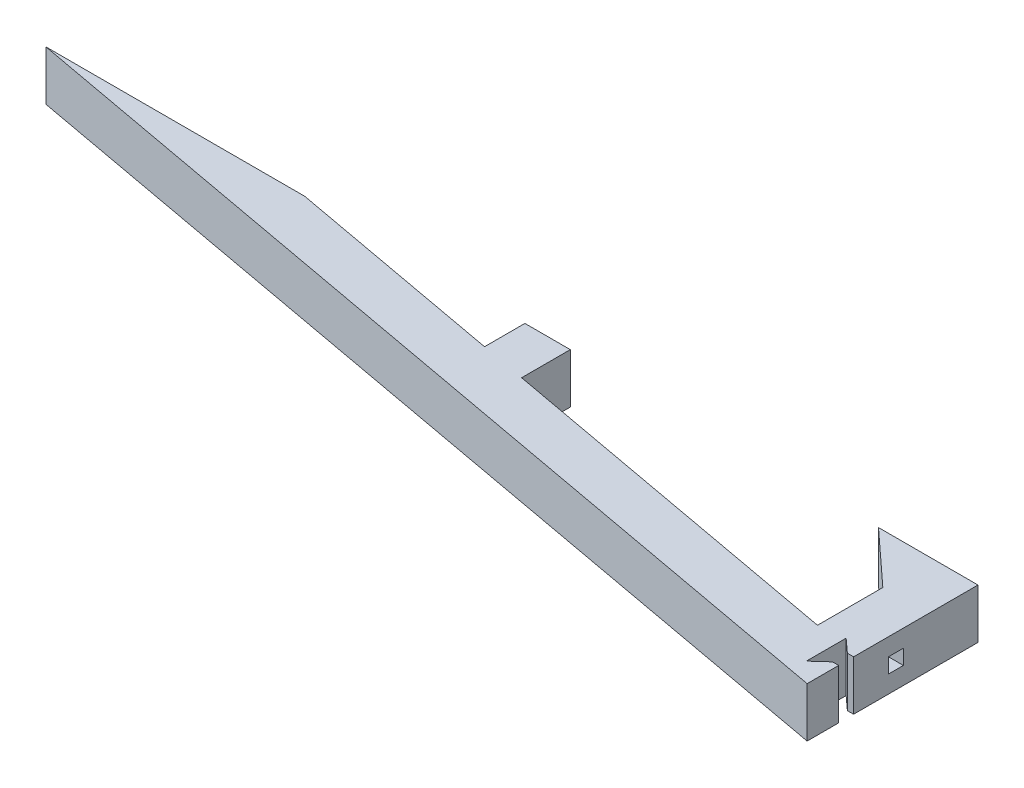
ISO-10303-21;
HEADER;
FILE_DESCRIPTION(('STEP AP214'),'2;1');
FILE_NAME('part.step','',(''),(''),'','','');
FILE_SCHEMA(('AUTOMOTIVE_DESIGN { 1 0 10303 214 1 1 1 1 }'));
ENDSEC;
DATA;
#1=APPLICATION_CONTEXT('core data for automotive mechanical design processes');
#2=APPLICATION_PROTOCOL_DEFINITION('international standard','automotive_design',2000,#1);
#3=PRODUCT_CONTEXT('',#1,'mechanical');
#4=PRODUCT('Part','Part','',(#3));
#5=PRODUCT_RELATED_PRODUCT_CATEGORY('part','',(#4));
#6=PRODUCT_DEFINITION_FORMATION('','',#4);
#7=PRODUCT_DEFINITION_CONTEXT('part definition',#1,'design');
#8=PRODUCT_DEFINITION('design','',#6,#7);
#9=PRODUCT_DEFINITION_SHAPE('','',#8);
#10=(LENGTH_UNIT() NAMED_UNIT(*) SI_UNIT(.MILLI.,.METRE.));
#11=(NAMED_UNIT(*) PLANE_ANGLE_UNIT() SI_UNIT($,.RADIAN.));
#12=(NAMED_UNIT(*) SI_UNIT($,.STERADIAN.) SOLID_ANGLE_UNIT());
#13=UNCERTAINTY_MEASURE_WITH_UNIT(LENGTH_MEASURE(1.E-05),#10,'distance_accuracy_value','');
#14=(GEOMETRIC_REPRESENTATION_CONTEXT(3) GLOBAL_UNCERTAINTY_ASSIGNED_CONTEXT((#13)) GLOBAL_UNIT_ASSIGNED_CONTEXT((#10,
#11,#12)) REPRESENTATION_CONTEXT('',''));
#15=CARTESIAN_POINT('',(0.,0.,0.));
#16=DIRECTION('',(0.,0.,1.));
#17=DIRECTION('',(1.,0.,0.));
#18=AXIS2_PLACEMENT_3D('',#15,#16,#17);
#19=CARTESIAN_POINT('',(0.,8.,0.));
#20=DIRECTION('',(-1.,0.,0.));
#21=DIRECTION('',(0.,0.,1.));
#22=AXIS2_PLACEMENT_3D('',#19,#20,#21);
#23=PLANE('',#22);
#24=DIRECTION('',(0.,0.,-1.));
#25=VECTOR('',#24,1.);
#26=CARTESIAN_POINT('',(0.,0.,0.));
#27=LINE('',#26,#25);
#28=CARTESIAN_POINT('',(0.,0.,27.47211487));
#29=VERTEX_POINT('',#28);
#30=CARTESIAN_POINT('',(0.,0.,22.4));
#31=VERTEX_POINT('',#30);
#32=EDGE_CURVE('E274',#29,#31,#27,.T.);
#33=ORIENTED_EDGE('',*,*,#32,.T.);
#34=DIRECTION('',(0.,1.,0.));
#35=VECTOR('',#34,1.);
#36=CARTESIAN_POINT('',(0.,0.,22.4));
#37=LINE('',#36,#35);
#38=CARTESIAN_POINT('',(0.,8.,22.4));
#39=VERTEX_POINT('',#38);
#40=EDGE_CURVE('E257',#31,#39,#37,.T.);
#41=ORIENTED_EDGE('',*,*,#40,.T.);
#42=DIRECTION('',(0.,0.,-1.));
#43=VECTOR('',#42,1.);
#44=CARTESIAN_POINT('',(0.,8.,0.));
#45=LINE('',#44,#43);
#46=CARTESIAN_POINT('',(0.,8.,27.47211487));
#47=VERTEX_POINT('',#46);
#48=EDGE_CURVE('E291',#47,#39,#45,.T.);
#49=ORIENTED_EDGE('',*,*,#48,.F.);
#50=DIRECTION('',(0.,-1.,0.));
#51=VECTOR('',#50,1.);
#52=CARTESIAN_POINT('',(0.,8.,27.47211487));
#53=LINE('',#52,#51);
#54=EDGE_CURVE('E318',#47,#29,#53,.T.);
#55=ORIENTED_EDGE('',*,*,#54,.T.);
#56=EDGE_LOOP('',(#33,#41,#49,#55));
#57=FACE_BOUND('',#56,.T.);
#58=ADVANCED_FACE('F33',(#57),#23,.F.);
#59=CARTESIAN_POINT('',(-7.3,8.,0.));
#60=DIRECTION('',(0.,0.,1.));
#61=DIRECTION('',(1.,0.,0.));
#62=AXIS2_PLACEMENT_3D('',#59,#60,#61);
#63=PLANE('',#62);
#64=CARTESIAN_POINT('',(-3.65,4.,0.));
#65=DIRECTION('',(0.,0.,-1.));
#66=DIRECTION('',(-1.,0.,0.));
#67=AXIS2_PLACEMENT_3D('',#64,#65,#66);
#68=CIRCLE('',#67,2.2);
#69=CARTESIAN_POINT('',(-5.85,4.,0.));
#70=VERTEX_POINT('',#69);
#71=EDGE_CURVE('E590',#70,#70,#68,.T.);
#72=ORIENTED_EDGE('',*,*,#71,.F.);
#73=EDGE_LOOP('',(#72));
#74=FACE_BOUND('',#73,.T.);
#75=DIRECTION('',(-1.,0.,0.));
#76=VECTOR('',#75,1.);
#77=CARTESIAN_POINT('',(-7.3,0.,0.));
#78=LINE('',#77,#76);
#79=CARTESIAN_POINT('',(0.,0.,0.));
#80=VERTEX_POINT('',#79);
#81=CARTESIAN_POINT('',(-16.,0.,0.));
#82=VERTEX_POINT('',#81);
#83=EDGE_CURVE('E260',#80,#82,#78,.T.);
#84=ORIENTED_EDGE('',*,*,#83,.T.);
#85=DIRECTION('',(0.,1.,0.));
#86=VECTOR('',#85,1.);
#87=CARTESIAN_POINT('',(-16.,0.,0.));
#88=LINE('',#87,#86);
#89=CARTESIAN_POINT('',(-16.,8.,0.));
#90=VERTEX_POINT('',#89);
#91=EDGE_CURVE('E222',#82,#90,#88,.T.);
#92=ORIENTED_EDGE('',*,*,#91,.T.);
#93=DIRECTION('',(-1.,0.,0.));
#94=VECTOR('',#93,1.);
#95=CARTESIAN_POINT('',(-7.3,8.,0.));
#96=LINE('',#95,#94);
#97=CARTESIAN_POINT('',(0.,8.,0.));
#98=VERTEX_POINT('',#97);
#99=EDGE_CURVE('E270',#98,#90,#96,.T.);
#100=ORIENTED_EDGE('',*,*,#99,.F.);
#101=DIRECTION('',(0.,-1.,0.));
#102=VECTOR('',#101,1.);
#103=CARTESIAN_POINT('',(0.,8.,0.));
#104=LINE('',#103,#102);
#105=EDGE_CURVE('E294',#98,#80,#104,.T.);
#106=ORIENTED_EDGE('',*,*,#105,.T.);
#107=EDGE_LOOP('',(#84,#92,#100,#106));
#108=FACE_BOUND('',#107,.T.);
#109=ADVANCED_FACE('F35',(#74,#108),#63,.F.);
#110=CARTESIAN_POINT('',(-7.3,8.,18.5087593431004));
#111=DIRECTION('',(1.,0.,0.));
#112=DIRECTION('',(0.,0.,-1.));
#113=AXIS2_PLACEMENT_3D('',#110,#111,#112);
#114=PLANE('',#113);
#115=DIRECTION('',(0.,0.,1.));
#116=VECTOR('',#115,1.);
#117=CARTESIAN_POINT('',(-7.3,8.,18.5087593431004));
#118=LINE('',#117,#116);
#119=CARTESIAN_POINT('',(-7.3,8.,8.));
#120=VERTEX_POINT('',#119);
#121=CARTESIAN_POINT('',(-7.3,8.,18.5087593431004));
#122=VERTEX_POINT('',#121);
#123=EDGE_CURVE('E273',#120,#122,#118,.T.);
#124=ORIENTED_EDGE('',*,*,#123,.F.);
#125=DIRECTION('',(0.,-1.,0.));
#126=VECTOR('',#125,1.);
#127=CARTESIAN_POINT('',(-7.3,8.,8.));
#128=LINE('',#127,#126);
#129=CARTESIAN_POINT('',(-7.3,0.,8.));
#130=VERTEX_POINT('',#129);
#131=EDGE_CURVE('E226',#120,#130,#128,.T.);
#132=ORIENTED_EDGE('',*,*,#131,.T.);
#133=DIRECTION('',(0.,0.,1.));
#134=VECTOR('',#133,1.);
#135=CARTESIAN_POINT('',(-7.3,0.,18.5087593431004));
#136=LINE('',#135,#134);
#137=CARTESIAN_POINT('',(-7.3,0.,18.5087593431004));
#138=VERTEX_POINT('',#137);
#139=EDGE_CURVE('E297',#130,#138,#136,.T.);
#140=ORIENTED_EDGE('',*,*,#139,.T.);
#141=DIRECTION('',(0.,-1.,0.));
#142=VECTOR('',#141,1.);
#143=CARTESIAN_POINT('',(-7.3,8.,18.5087593431004));
#144=LINE('',#143,#142);
#145=EDGE_CURVE('E11',#122,#138,#144,.T.);
#146=ORIENTED_EDGE('',*,*,#145,.F.);
#147=EDGE_LOOP('',(#124,#132,#140,#146));
#148=FACE_BOUND('',#147,.T.);
#149=ADVANCED_FACE('F368',(#148),#114,.F.);
#150=CARTESIAN_POINT('',(-65.55,8.,7.82944326528233));
#151=DIRECTION('',(-0.180330309758334,0.,0.983606109874508));
#152=DIRECTION('',(0.983606109874508,0.,0.180330309758334));
#153=AXIS2_PLACEMENT_3D('',#150,#151,#152);
#154=PLANE('',#153);
#155=DIRECTION('',(-0.983606109874508,0.,-0.180330309758334));
#156=VECTOR('',#155,1.);
#157=CARTESIAN_POINT('',(-65.55,0.,7.82944326528233));
#158=LINE('',#157,#156);
#159=CARTESIAN_POINT('',(-65.55,0.,7.82944326528233));
#160=VERTEX_POINT('',#159);
#161=EDGE_CURVE('E299',#138,#160,#158,.T.);
#162=ORIENTED_EDGE('',*,*,#161,.T.);
#163=DIRECTION('',(0.,-1.,0.));
#164=VECTOR('',#163,1.);
#165=CARTESIAN_POINT('',(-65.55,8.,7.82944326528233));
#166=LINE('',#165,#164);
#167=CARTESIAN_POINT('',(-65.55,8.,7.82944326528233));
#168=VERTEX_POINT('',#167);
#169=EDGE_CURVE('E41',#168,#160,#166,.T.);
#170=ORIENTED_EDGE('',*,*,#169,.F.);
#171=DIRECTION('',(-0.983606109874508,0.,-0.180330309758334));
#172=VECTOR('',#171,1.);
#173=CARTESIAN_POINT('',(-65.55,8.,7.82944326528233));
#174=LINE('',#173,#172);
#175=EDGE_CURVE('E276',#122,#168,#174,.T.);
#176=ORIENTED_EDGE('',*,*,#175,.F.);
#177=ORIENTED_EDGE('',*,*,#145,.T.);
#178=EDGE_LOOP('',(#162,#170,#176,#177));
#179=FACE_BOUND('',#178,.T.);
#180=ADVANCED_FACE('F366',(#179),#154,.F.);
#181=CARTESIAN_POINT('',(-65.55,8.,7.82944326528233));
#182=DIRECTION('',(-1.,0.,0.));
#183=DIRECTION('',(0.,0.,1.));
#184=AXIS2_PLACEMENT_3D('',#181,#182,#183);
#185=PLANE('',#184);
#186=DIRECTION('',(0.,0.,-1.));
#187=VECTOR('',#186,1.);
#188=CARTESIAN_POINT('',(-65.55,0.,7.82944326528233));
#189=LINE('',#188,#187);
#190=CARTESIAN_POINT('',(-65.55,0.,0.));
#191=VERTEX_POINT('',#190);
#192=EDGE_CURVE('E301',#160,#191,#189,.T.);
#193=ORIENTED_EDGE('',*,*,#192,.T.);
#194=DIRECTION('',(0.,-1.,0.));
#195=VECTOR('',#194,1.);
#196=CARTESIAN_POINT('',(-65.55,8.,0.));
#197=LINE('',#196,#195);
#198=CARTESIAN_POINT('',(-65.55,8.,0.));
#199=VERTEX_POINT('',#198);
#200=EDGE_CURVE('E333',#199,#191,#197,.T.);
#201=ORIENTED_EDGE('',*,*,#200,.F.);
#202=DIRECTION('',(0.,0.,-1.));
#203=VECTOR('',#202,1.);
#204=CARTESIAN_POINT('',(-65.55,8.,7.82944326528233));
#205=LINE('',#204,#203);
#206=EDGE_CURVE('E278',#168,#199,#205,.T.);
#207=ORIENTED_EDGE('',*,*,#206,.F.);
#208=ORIENTED_EDGE('',*,*,#169,.T.);
#209=EDGE_LOOP('',(#193,#201,#207,#208));
#210=FACE_BOUND('',#209,.T.);
#211=ADVANCED_FACE('F340',(#210),#185,.F.);
#212=CARTESIAN_POINT('',(-65.55,8.,0.));
#213=DIRECTION('',(0.,0.,1.));
#214=DIRECTION('',(1.,0.,0.));
#215=AXIS2_PLACEMENT_3D('',#212,#213,#214);
#216=PLANE('',#215);
#217=CARTESIAN_POINT('',(-69.2,4.,0.));
#218=DIRECTION('',(0.,0.,-1.));
#219=DIRECTION('',(-1.,0.,0.));
#220=AXIS2_PLACEMENT_3D('',#217,#218,#219);
#221=CIRCLE('',#220,2.2);
#222=CARTESIAN_POINT('',(-71.4,4.,0.));
#223=VERTEX_POINT('',#222);
#224=EDGE_CURVE('E202',#223,#223,#221,.T.);
#225=ORIENTED_EDGE('',*,*,#224,.F.);
#226=EDGE_LOOP('',(#225));
#227=FACE_BOUND('',#226,.T.);
#228=DIRECTION('',(-1.,0.,0.));
#229=VECTOR('',#228,1.);
#230=CARTESIAN_POINT('',(-65.55,0.,0.));
#231=LINE('',#230,#229);
#232=CARTESIAN_POINT('',(-72.85,0.,0.));
#233=VERTEX_POINT('',#232);
#234=EDGE_CURVE('E303',#191,#233,#231,.T.);
#235=ORIENTED_EDGE('',*,*,#234,.T.);
#236=DIRECTION('',(0.,-1.,0.));
#237=VECTOR('',#236,1.);
#238=CARTESIAN_POINT('',(-72.85,8.,0.));
#239=LINE('',#238,#237);
#240=CARTESIAN_POINT('',(-72.85,8.,0.));
#241=VERTEX_POINT('',#240);
#242=EDGE_CURVE('E330',#241,#233,#239,.T.);
#243=ORIENTED_EDGE('',*,*,#242,.F.);
#244=DIRECTION('',(-1.,0.,0.));
#245=VECTOR('',#244,1.);
#246=CARTESIAN_POINT('',(-65.55,8.,0.));
#247=LINE('',#246,#245);
#248=EDGE_CURVE('E280',#199,#241,#247,.T.);
#249=ORIENTED_EDGE('',*,*,#248,.F.);
#250=ORIENTED_EDGE('',*,*,#200,.T.);
#251=EDGE_LOOP('',(#235,#243,#249,#250));
#252=FACE_BOUND('',#251,.T.);
#253=ADVANCED_FACE('F354',(#227,#252),#216,.F.);
#254=CARTESIAN_POINT('',(-72.85,8.,0.));
#255=DIRECTION('',(1.,0.,0.));
#256=DIRECTION('',(0.,0.,-1.));
#257=AXIS2_PLACEMENT_3D('',#254,#255,#256);
#258=PLANE('',#257);
#259=DIRECTION('',(0.,0.,1.));
#260=VECTOR('',#259,1.);
#261=CARTESIAN_POINT('',(-72.85,0.,0.));
#262=LINE('',#261,#260);
#263=CARTESIAN_POINT('',(-72.85,0.,6.49109120746135));
#264=VERTEX_POINT('',#263);
#265=EDGE_CURVE('E305',#233,#264,#262,.T.);
#266=ORIENTED_EDGE('',*,*,#265,.T.);
#267=DIRECTION('',(0.,-1.,0.));
#268=VECTOR('',#267,1.);
#269=CARTESIAN_POINT('',(-72.85,8.,6.49109120746135));
#270=LINE('',#269,#268);
#271=CARTESIAN_POINT('',(-72.85,8.,6.49109120746135));
#272=VERTEX_POINT('',#271);
#273=EDGE_CURVE('E327',#272,#264,#270,.T.);
#274=ORIENTED_EDGE('',*,*,#273,.F.);
#275=DIRECTION('',(0.,0.,1.));
#276=VECTOR('',#275,1.);
#277=CARTESIAN_POINT('',(-72.85,8.,0.));
#278=LINE('',#277,#276);
#279=EDGE_CURVE('E282',#241,#272,#278,.T.);
#280=ORIENTED_EDGE('',*,*,#279,.F.);
#281=ORIENTED_EDGE('',*,*,#242,.T.);
#282=EDGE_LOOP('',(#266,#274,#280,#281));
#283=FACE_BOUND('',#282,.T.);
#284=ADVANCED_FACE('F358',(#283),#258,.F.);
#285=CARTESIAN_POINT('',(-72.85,8.,6.49109120746135));
#286=DIRECTION('',(-0.180330309758334,0.,0.983606109874508));
#287=DIRECTION('',(0.983606109874508,0.,0.180330309758334));
#288=AXIS2_PLACEMENT_3D('',#285,#286,#287);
#289=PLANE('',#288);
#290=DIRECTION('',(-0.983606109874508,0.,-0.180330309758334));
#291=VECTOR('',#290,1.);
#292=CARTESIAN_POINT('',(-72.85,0.,6.49109120746135));
#293=LINE('',#292,#291);
#294=CARTESIAN_POINT('',(-108.259653873212,0.,-0.000769494996487487));
#295=VERTEX_POINT('',#294);
#296=EDGE_CURVE('E307',#264,#295,#293,.T.);
#297=ORIENTED_EDGE('',*,*,#296,.T.);
#298=DIRECTION('',(0.,-1.,0.));
#299=VECTOR('',#298,1.);
#300=CARTESIAN_POINT('',(-108.259653873212,8.,-0.000769494996487487));
#301=LINE('',#300,#299);
#302=CARTESIAN_POINT('',(-108.259653873212,8.,-0.000769494996487487));
#303=VERTEX_POINT('',#302);
#304=EDGE_CURVE('E324',#303,#295,#301,.T.);
#305=ORIENTED_EDGE('',*,*,#304,.F.);
#306=DIRECTION('',(-0.983606109874508,0.,-0.180330309758334));
#307=VECTOR('',#306,1.);
#308=CARTESIAN_POINT('',(-72.85,8.,6.49109120746135));
#309=LINE('',#308,#307);
#310=EDGE_CURVE('E284',#272,#303,#309,.T.);
#311=ORIENTED_EDGE('',*,*,#310,.F.);
#312=ORIENTED_EDGE('',*,*,#273,.T.);
#313=EDGE_LOOP('',(#297,#305,#311,#312));
#314=FACE_BOUND('',#313,.T.);
#315=ADVANCED_FACE('F410',(#314),#289,.F.);
#316=CARTESIAN_POINT('',(-108.259653873212,8.,-0.000769494996487487));
#317=DIRECTION('',(0.,0.,1.));
#318=DIRECTION('',(1.,0.,0.));
#319=AXIS2_PLACEMENT_3D('',#316,#317,#318);
#320=PLANE('',#319);
#321=DIRECTION('',(-1.,0.,0.));
#322=VECTOR('',#321,1.);
#323=CARTESIAN_POINT('',(-108.259653873212,0.,-0.000769494996487487));
#324=LINE('',#323,#322);
#325=CARTESIAN_POINT('',(-149.85,0.,-0.000769494996482462));
#326=VERTEX_POINT('',#325);
#327=EDGE_CURVE('E309',#295,#326,#324,.T.);
#328=ORIENTED_EDGE('',*,*,#327,.T.);
#329=DIRECTION('',(0.,-1.,0.));
#330=VECTOR('',#329,1.);
#331=CARTESIAN_POINT('',(-149.85,8.,-0.000769494996482462));
#332=LINE('',#331,#330);
#333=CARTESIAN_POINT('',(-149.85,8.,-0.000769494996482462));
#334=VERTEX_POINT('',#333);
#335=EDGE_CURVE('E321',#334,#326,#332,.T.);
#336=ORIENTED_EDGE('',*,*,#335,.F.);
#337=DIRECTION('',(-1.,0.,0.));
#338=VECTOR('',#337,1.);
#339=CARTESIAN_POINT('',(-108.259653873212,8.,-0.000769494996487487));
#340=LINE('',#339,#338);
#341=EDGE_CURVE('E286',#303,#334,#340,.T.);
#342=ORIENTED_EDGE('',*,*,#341,.F.);
#343=ORIENTED_EDGE('',*,*,#304,.T.);
#344=EDGE_LOOP('',(#328,#336,#342,#343));
#345=FACE_BOUND('',#344,.T.);
#346=ADVANCED_FACE('F408',(#345),#320,.F.);
#347=CARTESIAN_POINT('',(0.,8.,27.47211487));
#348=DIRECTION('',(0.180330309758334,0.,-0.983606109874508));
#349=DIRECTION('',(-0.983606109874508,0.,-0.180330309758334));
#350=AXIS2_PLACEMENT_3D('',#347,#348,#349);
#351=PLANE('',#350);
#352=DIRECTION('',(0.983606109874508,0.,0.180330309758334));
#353=VECTOR('',#352,1.);
#354=CARTESIAN_POINT('',(0.,0.,27.47211487));
#355=LINE('',#354,#353);
#356=EDGE_CURVE('E311',#326,#29,#355,.T.);
#357=ORIENTED_EDGE('',*,*,#356,.T.);
#358=ORIENTED_EDGE('',*,*,#54,.F.);
#359=DIRECTION('',(0.983606109874508,0.,0.180330309758334));
#360=VECTOR('',#359,1.);
#361=CARTESIAN_POINT('',(0.,8.,27.47211487));
#362=LINE('',#361,#360);
#363=EDGE_CURVE('E288',#334,#47,#362,.T.);
#364=ORIENTED_EDGE('',*,*,#363,.F.);
#365=ORIENTED_EDGE('',*,*,#335,.T.);
#366=EDGE_LOOP('',(#357,#358,#364,#365));
#367=FACE_BOUND('',#366,.T.);
#368=ADVANCED_FACE('F404',(#367),#351,.F.);
#369=DIRECTION('',(0.,0.,-1.));
#370=VECTOR('',#369,1.);
#371=CARTESIAN_POINT('',(0.,2.8,14.4));
#372=LINE('',#371,#370);
#373=CARTESIAN_POINT('',(0.,2.8,14.4));
#374=VERTEX_POINT('',#373);
#375=CARTESIAN_POINT('',(0.,2.8,12.));
#376=VERTEX_POINT('',#375);
#377=EDGE_CURVE('E208',#374,#376,#372,.T.);
#378=ORIENTED_EDGE('',*,*,#377,.F.);
#379=DIRECTION('',(0.,-1.,0.));
#380=VECTOR('',#379,1.);
#381=CARTESIAN_POINT('',(0.,5.2,14.4));
#382=LINE('',#381,#380);
#383=CARTESIAN_POINT('',(0.,5.2,14.4));
#384=VERTEX_POINT('',#383);
#385=EDGE_CURVE('E48',#384,#374,#382,.T.);
#386=ORIENTED_EDGE('',*,*,#385,.F.);
#387=DIRECTION('',(0.,0.,1.));
#388=VECTOR('',#387,1.);
#389=CARTESIAN_POINT('',(0.,5.2,14.4));
#390=LINE('',#389,#388);
#391=CARTESIAN_POINT('',(0.,5.2,12.));
#392=VERTEX_POINT('',#391);
#393=EDGE_CURVE('E196',#392,#384,#390,.T.);
#394=ORIENTED_EDGE('',*,*,#393,.F.);
#395=DIRECTION('',(0.,1.,0.));
#396=VECTOR('',#395,1.);
#397=CARTESIAN_POINT('',(0.,5.2,12.));
#398=LINE('',#397,#396);
#399=EDGE_CURVE('E199',#376,#392,#398,.T.);
#400=ORIENTED_EDGE('',*,*,#399,.F.);
#401=EDGE_LOOP('',(#378,#386,#394,#400));
#402=FACE_BOUND('',#401,.T.);
#403=CARTESIAN_POINT('',(0.,0.,20.));
#404=VERTEX_POINT('',#403);
#405=EDGE_CURVE('E313',#404,#80,#27,.T.);
#406=ORIENTED_EDGE('',*,*,#405,.T.);
#407=ORIENTED_EDGE('',*,*,#105,.F.);
#408=CARTESIAN_POINT('',(0.,8.,20.));
#409=VERTEX_POINT('',#408);
#410=EDGE_CURVE('E290',#409,#98,#45,.T.);
#411=ORIENTED_EDGE('',*,*,#410,.F.);
#412=DIRECTION('',(0.,1.,0.));
#413=VECTOR('',#412,1.);
#414=CARTESIAN_POINT('',(0.,0.,20.));
#415=LINE('',#414,#413);
#416=EDGE_CURVE('E244',#404,#409,#415,.T.);
#417=ORIENTED_EDGE('',*,*,#416,.F.);
#418=EDGE_LOOP('',(#406,#407,#411,#417));
#419=FACE_BOUND('',#418,.T.);
#420=ADVANCED_FACE('F377',(#402,#419),#23,.F.);
#421=CARTESIAN_POINT('',(0.,8.,0.));
#422=DIRECTION('',(0.,-1.,0.));
#423=DIRECTION('',(0.,0.,-1.));
#424=AXIS2_PLACEMENT_3D('',#421,#422,#423);
#425=PLANE('',#424);
#426=ORIENTED_EDGE('',*,*,#99,.T.);
#427=DIRECTION('',(0.736099620693866,0.,0.676873214431141));
#428=VECTOR('',#427,1.);
#429=CARTESIAN_POINT('',(-16.,8.,0.));
#430=LINE('',#429,#428);
#431=EDGE_CURVE('E219',#90,#120,#430,.T.);
#432=ORIENTED_EDGE('',*,*,#431,.T.);
#433=ORIENTED_EDGE('',*,*,#123,.T.);
#434=ORIENTED_EDGE('',*,*,#175,.T.);
#435=ORIENTED_EDGE('',*,*,#206,.T.);
#436=ORIENTED_EDGE('',*,*,#248,.T.);
#437=ORIENTED_EDGE('',*,*,#279,.T.);
#438=ORIENTED_EDGE('',*,*,#310,.T.);
#439=ORIENTED_EDGE('',*,*,#341,.T.);
#440=ORIENTED_EDGE('',*,*,#363,.T.);
#441=ORIENTED_EDGE('',*,*,#48,.T.);
#442=DIRECTION('',(1.,0.,0.));
#443=VECTOR('',#442,1.);
#444=CARTESIAN_POINT('',(-0.999999999999996,8.,22.4));
#445=LINE('',#444,#443);
#446=CARTESIAN_POINT('',(-0.999999999999996,8.,22.4));
#447=VERTEX_POINT('',#446);
#448=EDGE_CURVE('E233',#447,#39,#445,.T.);
#449=ORIENTED_EDGE('',*,*,#448,.F.);
#450=DIRECTION('',(0.739940073395943,0.,-0.672672793996313));
#451=VECTOR('',#450,1.);
#452=CARTESIAN_POINT('',(-3.2,8.,24.4));
#453=LINE('',#452,#451);
#454=CARTESIAN_POINT('',(-3.2,8.,24.4));
#455=VERTEX_POINT('',#454);
#456=EDGE_CURVE('E253',#455,#447,#453,.T.);
#457=ORIENTED_EDGE('',*,*,#456,.F.);
#458=DIRECTION('',(0.,0.,1.));
#459=VECTOR('',#458,1.);
#460=CARTESIAN_POINT('',(-3.2,8.,18.));
#461=LINE('',#460,#459);
#462=CARTESIAN_POINT('',(-3.2,8.,18.));
#463=VERTEX_POINT('',#462);
#464=EDGE_CURVE('E250',#463,#455,#461,.T.);
#465=ORIENTED_EDGE('',*,*,#464,.F.);
#466=DIRECTION('',(-0.739940073395941,0.,-0.672672793996315));
#467=VECTOR('',#466,1.);
#468=CARTESIAN_POINT('',(-1.00000000000001,8.,20.));
#469=LINE('',#468,#467);
#470=CARTESIAN_POINT('',(-1.00000000000001,8.,20.));
#471=VERTEX_POINT('',#470);
#472=EDGE_CURVE('E247',#471,#463,#469,.T.);
#473=ORIENTED_EDGE('',*,*,#472,.F.);
#474=DIRECTION('',(-1.,0.,0.));
#475=VECTOR('',#474,1.);
#476=CARTESIAN_POINT('',(0.,8.,20.));
#477=LINE('',#476,#475);
#478=EDGE_CURVE('E229',#409,#471,#477,.T.);
#479=ORIENTED_EDGE('',*,*,#478,.F.);
#480=ORIENTED_EDGE('',*,*,#410,.T.);
#481=EDGE_LOOP('',(#426,#432,#433,#434,#435,#436,#437,#438,#439,#440,#441,#449,#457,#465,#473,
#479,#480));
#482=FACE_BOUND('',#481,.T.);
#483=ADVANCED_FACE('F362',(#482),#425,.F.);
#484=CARTESIAN_POINT('',(0.,0.,0.));
#485=DIRECTION('',(0.,-1.,0.));
#486=DIRECTION('',(0.,0.,-1.));
#487=AXIS2_PLACEMENT_3D('',#484,#485,#486);
#488=PLANE('',#487);
#489=DIRECTION('',(0.736099620693866,0.,0.676873214431141));
#490=VECTOR('',#489,1.);
#491=CARTESIAN_POINT('',(-16.,0.,0.));
#492=LINE('',#491,#490);
#493=EDGE_CURVE('E215',#82,#130,#492,.T.);
#494=ORIENTED_EDGE('',*,*,#493,.F.);
#495=ORIENTED_EDGE('',*,*,#83,.F.);
#496=ORIENTED_EDGE('',*,*,#405,.F.);
#497=DIRECTION('',(-1.,0.,0.));
#498=VECTOR('',#497,1.);
#499=CARTESIAN_POINT('',(0.,0.,20.));
#500=LINE('',#499,#498);
#501=CARTESIAN_POINT('',(-1.00000000000001,0.,20.));
#502=VERTEX_POINT('',#501);
#503=EDGE_CURVE('E230',#404,#502,#500,.T.);
#504=ORIENTED_EDGE('',*,*,#503,.T.);
#505=DIRECTION('',(-0.739940073395941,0.,-0.672672793996315));
#506=VECTOR('',#505,1.);
#507=CARTESIAN_POINT('',(-1.00000000000001,0.,20.));
#508=LINE('',#507,#506);
#509=CARTESIAN_POINT('',(-3.2,0.,18.));
#510=VERTEX_POINT('',#509);
#511=EDGE_CURVE('E56',#502,#510,#508,.T.);
#512=ORIENTED_EDGE('',*,*,#511,.T.);
#513=DIRECTION('',(0.,0.,1.));
#514=VECTOR('',#513,1.);
#515=CARTESIAN_POINT('',(-3.2,0.,18.));
#516=LINE('',#515,#514);
#517=CARTESIAN_POINT('',(-3.2,0.,24.4));
#518=VERTEX_POINT('',#517);
#519=EDGE_CURVE('E235',#510,#518,#516,.T.);
#520=ORIENTED_EDGE('',*,*,#519,.T.);
#521=DIRECTION('',(0.739940073395943,0.,-0.672672793996313));
#522=VECTOR('',#521,1.);
#523=CARTESIAN_POINT('',(-3.2,0.,24.4));
#524=LINE('',#523,#522);
#525=CARTESIAN_POINT('',(-0.999999999999996,0.,22.4));
#526=VERTEX_POINT('',#525);
#527=EDGE_CURVE('E238',#518,#526,#524,.T.);
#528=ORIENTED_EDGE('',*,*,#527,.T.);
#529=DIRECTION('',(1.,0.,0.));
#530=VECTOR('',#529,1.);
#531=CARTESIAN_POINT('',(-0.999999999999996,0.,22.4));
#532=LINE('',#531,#530);
#533=EDGE_CURVE('E241',#526,#31,#532,.T.);
#534=ORIENTED_EDGE('',*,*,#533,.T.);
#535=ORIENTED_EDGE('',*,*,#32,.F.);
#536=ORIENTED_EDGE('',*,*,#356,.F.);
#537=ORIENTED_EDGE('',*,*,#327,.F.);
#538=ORIENTED_EDGE('',*,*,#296,.F.);
#539=ORIENTED_EDGE('',*,*,#265,.F.);
#540=ORIENTED_EDGE('',*,*,#234,.F.);
#541=ORIENTED_EDGE('',*,*,#192,.F.);
#542=ORIENTED_EDGE('',*,*,#161,.F.);
#543=ORIENTED_EDGE('',*,*,#139,.F.);
#544=EDGE_LOOP('',(#494,#495,#496,#504,#512,#520,#528,#534,#535,#536,#537,#538,#539,#540,#541,
#542,#543));
#545=FACE_BOUND('',#544,.T.);
#546=ADVANCED_FACE('F348',(#545),#488,.T.);
#547=CARTESIAN_POINT('',(-0.999999999999996,0.,22.4));
#548=DIRECTION('',(0.,0.,1.));
#549=DIRECTION('',(1.,0.,0.));
#550=AXIS2_PLACEMENT_3D('',#547,#548,#549);
#551=PLANE('',#550);
#552=ORIENTED_EDGE('',*,*,#448,.T.);
#553=ORIENTED_EDGE('',*,*,#40,.F.);
#554=ORIENTED_EDGE('',*,*,#533,.F.);
#555=DIRECTION('',(0.,1.,0.));
#556=VECTOR('',#555,1.);
#557=CARTESIAN_POINT('',(-0.999999999999996,0.,22.4));
#558=LINE('',#557,#556);
#559=EDGE_CURVE('E261',#526,#447,#558,.T.);
#560=ORIENTED_EDGE('',*,*,#559,.T.);
#561=EDGE_LOOP('',(#552,#553,#554,#560));
#562=FACE_BOUND('',#561,.T.);
#563=ADVANCED_FACE('F396',(#562),#551,.F.);
#564=CARTESIAN_POINT('',(-3.2,0.,24.4));
#565=DIRECTION('',(0.672672793996313,0.,0.739940073395943));
#566=DIRECTION('',(0.739940073395943,0.,-0.672672793996313));
#567=AXIS2_PLACEMENT_3D('',#564,#565,#566);
#568=PLANE('',#567);
#569=ORIENTED_EDGE('',*,*,#456,.T.);
#570=ORIENTED_EDGE('',*,*,#559,.F.);
#571=ORIENTED_EDGE('',*,*,#527,.F.);
#572=DIRECTION('',(0.,1.,0.));
#573=VECTOR('',#572,1.);
#574=CARTESIAN_POINT('',(-3.2,0.,24.4));
#575=LINE('',#574,#573);
#576=EDGE_CURVE('E263',#518,#455,#575,.T.);
#577=ORIENTED_EDGE('',*,*,#576,.T.);
#578=EDGE_LOOP('',(#569,#570,#571,#577));
#579=FACE_BOUND('',#578,.T.);
#580=ADVANCED_FACE('F394',(#579),#568,.F.);
#581=CARTESIAN_POINT('',(-3.2,0.,18.));
#582=DIRECTION('',(-1.,0.,0.));
#583=DIRECTION('',(0.,0.,1.));
#584=AXIS2_PLACEMENT_3D('',#581,#582,#583);
#585=PLANE('',#584);
#586=ORIENTED_EDGE('',*,*,#464,.T.);
#587=ORIENTED_EDGE('',*,*,#576,.F.);
#588=ORIENTED_EDGE('',*,*,#519,.F.);
#589=DIRECTION('',(0.,1.,0.));
#590=VECTOR('',#589,1.);
#591=CARTESIAN_POINT('',(-3.2,0.,18.));
#592=LINE('',#591,#590);
#593=EDGE_CURVE('E265',#510,#463,#592,.T.);
#594=ORIENTED_EDGE('',*,*,#593,.T.);
#595=EDGE_LOOP('',(#586,#587,#588,#594));
#596=FACE_BOUND('',#595,.T.);
#597=ADVANCED_FACE('F389',(#596),#585,.F.);
#598=CARTESIAN_POINT('',(-1.00000000000001,0.,20.));
#599=DIRECTION('',(0.672672793996316,0.,-0.739940073395941));
#600=DIRECTION('',(-0.739940073395941,0.,-0.672672793996315));
#601=AXIS2_PLACEMENT_3D('',#598,#599,#600);
#602=PLANE('',#601);
#603=ORIENTED_EDGE('',*,*,#472,.T.);
#604=ORIENTED_EDGE('',*,*,#593,.F.);
#605=ORIENTED_EDGE('',*,*,#511,.F.);
#606=DIRECTION('',(0.,1.,0.));
#607=VECTOR('',#606,1.);
#608=CARTESIAN_POINT('',(-1.00000000000001,0.,20.));
#609=LINE('',#608,#607);
#610=EDGE_CURVE('E267',#502,#471,#609,.T.);
#611=ORIENTED_EDGE('',*,*,#610,.T.);
#612=EDGE_LOOP('',(#603,#604,#605,#611));
#613=FACE_BOUND('',#612,.T.);
#614=ADVANCED_FACE('F383',(#613),#602,.F.);
#615=CARTESIAN_POINT('',(0.,0.,20.));
#616=DIRECTION('',(0.,0.,-1.));
#617=DIRECTION('',(-1.,0.,0.));
#618=AXIS2_PLACEMENT_3D('',#615,#616,#617);
#619=PLANE('',#618);
#620=ORIENTED_EDGE('',*,*,#478,.T.);
#621=ORIENTED_EDGE('',*,*,#610,.F.);
#622=ORIENTED_EDGE('',*,*,#503,.F.);
#623=ORIENTED_EDGE('',*,*,#416,.T.);
#624=EDGE_LOOP('',(#620,#621,#622,#623));
#625=FACE_BOUND('',#624,.T.);
#626=ADVANCED_FACE('F380',(#625),#619,.F.);
#627=CARTESIAN_POINT('',(-16.,8.,0.));
#628=DIRECTION('',(0.676873214431141,0.,-0.736099620693866));
#629=DIRECTION('',(-0.736099620693866,0.,-0.676873214431141));
#630=AXIS2_PLACEMENT_3D('',#627,#628,#629);
#631=PLANE('',#630);
#632=ORIENTED_EDGE('',*,*,#493,.T.);
#633=ORIENTED_EDGE('',*,*,#131,.F.);
#634=ORIENTED_EDGE('',*,*,#431,.F.);
#635=ORIENTED_EDGE('',*,*,#91,.F.);
#636=EDGE_LOOP('',(#632,#633,#634,#635));
#637=FACE_BOUND('',#636,.T.);
#638=ADVANCED_FACE('F447',(#637),#631,.F.);
#639=CARTESIAN_POINT('',(-4.4,5.2,14.4));
#640=DIRECTION('',(0.,0.,1.));
#641=DIRECTION('',(1.,0.,0.));
#642=AXIS2_PLACEMENT_3D('',#639,#640,#641);
#643=PLANE('',#642);
#644=ORIENTED_EDGE('',*,*,#385,.T.);
#645=DIRECTION('',(1.,0.,0.));
#646=VECTOR('',#645,1.);
#647=CARTESIAN_POINT('',(-4.4,2.8,14.4));
#648=LINE('',#647,#646);
#649=CARTESIAN_POINT('',(-4.4,2.8,14.4));
#650=VERTEX_POINT('',#649);
#651=EDGE_CURVE('E174',#650,#374,#648,.T.);
#652=ORIENTED_EDGE('',*,*,#651,.F.);
#653=DIRECTION('',(0.,-1.,0.));
#654=VECTOR('',#653,1.);
#655=CARTESIAN_POINT('',(-4.4,5.2,14.4));
#656=LINE('',#655,#654);
#657=CARTESIAN_POINT('',(-4.4,5.2,14.4));
#658=VERTEX_POINT('',#657);
#659=EDGE_CURVE('E178',#658,#650,#656,.T.);
#660=ORIENTED_EDGE('',*,*,#659,.F.);
#661=DIRECTION('',(1.,0.,0.));
#662=VECTOR('',#661,1.);
#663=CARTESIAN_POINT('',(-4.4,5.2,14.4));
#664=LINE('',#663,#662);
#665=EDGE_CURVE('E213',#658,#384,#664,.T.);
#666=ORIENTED_EDGE('',*,*,#665,.T.);
#667=EDGE_LOOP('',(#644,#652,#660,#666));
#668=FACE_BOUND('',#667,.T.);
#669=ADVANCED_FACE('F176',(#668),#643,.F.);
#670=CARTESIAN_POINT('',(-4.4,5.2,14.4));
#671=DIRECTION('',(0.,1.,0.));
#672=DIRECTION('',(0.,0.,1.));
#673=AXIS2_PLACEMENT_3D('',#670,#671,#672);
#674=PLANE('',#673);
#675=ORIENTED_EDGE('',*,*,#393,.T.);
#676=ORIENTED_EDGE('',*,*,#665,.F.);
#677=DIRECTION('',(0.,0.,1.));
#678=VECTOR('',#677,1.);
#679=CARTESIAN_POINT('',(-4.4,5.2,14.4));
#680=LINE('',#679,#678);
#681=CARTESIAN_POINT('',(-4.4,5.2,12.));
#682=VERTEX_POINT('',#681);
#683=EDGE_CURVE('E184',#682,#658,#680,.T.);
#684=ORIENTED_EDGE('',*,*,#683,.F.);
#685=DIRECTION('',(1.,0.,0.));
#686=VECTOR('',#685,1.);
#687=CARTESIAN_POINT('',(-4.4,5.2,12.));
#688=LINE('',#687,#686);
#689=EDGE_CURVE('E216',#682,#392,#688,.T.);
#690=ORIENTED_EDGE('',*,*,#689,.T.);
#691=EDGE_LOOP('',(#675,#676,#684,#690));
#692=FACE_BOUND('',#691,.T.);
#693=ADVANCED_FACE('F439',(#692),#674,.F.);
#694=CARTESIAN_POINT('',(-4.4,5.2,12.));
#695=DIRECTION('',(0.,0.,-1.));
#696=DIRECTION('',(-1.,0.,0.));
#697=AXIS2_PLACEMENT_3D('',#694,#695,#696);
#698=PLANE('',#697);
#699=ORIENTED_EDGE('',*,*,#399,.T.);
#700=ORIENTED_EDGE('',*,*,#689,.F.);
#701=DIRECTION('',(0.,1.,0.));
#702=VECTOR('',#701,1.);
#703=CARTESIAN_POINT('',(-4.4,5.2,12.));
#704=LINE('',#703,#702);
#705=CARTESIAN_POINT('',(-4.4,2.8,12.));
#706=VERTEX_POINT('',#705);
#707=EDGE_CURVE('E192',#706,#682,#704,.T.);
#708=ORIENTED_EDGE('',*,*,#707,.F.);
#709=DIRECTION('',(1.,0.,0.));
#710=VECTOR('',#709,1.);
#711=CARTESIAN_POINT('',(-4.4,2.8,12.));
#712=LINE('',#711,#710);
#713=EDGE_CURVE('E183',#706,#376,#712,.T.);
#714=ORIENTED_EDGE('',*,*,#713,.T.);
#715=EDGE_LOOP('',(#699,#700,#708,#714));
#716=FACE_BOUND('',#715,.T.);
#717=ADVANCED_FACE('F437',(#716),#698,.F.);
#718=CARTESIAN_POINT('',(-4.4,2.8,14.4));
#719=DIRECTION('',(0.,-1.,0.));
#720=DIRECTION('',(0.,0.,-1.));
#721=AXIS2_PLACEMENT_3D('',#718,#719,#720);
#722=PLANE('',#721);
#723=ORIENTED_EDGE('',*,*,#377,.T.);
#724=ORIENTED_EDGE('',*,*,#713,.F.);
#725=DIRECTION('',(0.,0.,-1.));
#726=VECTOR('',#725,1.);
#727=CARTESIAN_POINT('',(-4.4,2.8,14.4));
#728=LINE('',#727,#726);
#729=EDGE_CURVE('E187',#650,#706,#728,.T.);
#730=ORIENTED_EDGE('',*,*,#729,.F.);
#731=ORIENTED_EDGE('',*,*,#651,.T.);
#732=EDGE_LOOP('',(#723,#724,#730,#731));
#733=FACE_BOUND('',#732,.T.);
#734=ADVANCED_FACE('F188',(#733),#722,.F.);
#735=CARTESIAN_POINT('',(-4.4,0.,0.));
#736=DIRECTION('',(1.,0.,0.));
#737=DIRECTION('',(0.,0.,-1.));
#738=AXIS2_PLACEMENT_3D('',#735,#736,#737);
#739=PLANE('',#738);
#740=ORIENTED_EDGE('',*,*,#659,.T.);
#741=ORIENTED_EDGE('',*,*,#729,.T.);
#742=ORIENTED_EDGE('',*,*,#707,.T.);
#743=ORIENTED_EDGE('',*,*,#683,.T.);
#744=EDGE_LOOP('',(#740,#741,#742,#743));
#745=FACE_BOUND('',#744,.T.);
#746=ADVANCED_FACE('F194',(#745),#739,.T.);
#747=CARTESIAN_POINT('',(-69.2,4.,9.40000000000001));
#748=DIRECTION('',(0.,0.,-1.));
#749=DIRECTION('',(-1.,0.,0.));
#750=AXIS2_PLACEMENT_3D('',#747,#748,#749);
#751=CYLINDRICAL_SURFACE('',#750,2.2);
#752=CARTESIAN_POINT('',(-69.2,4.,9.40000000000001));
#753=DIRECTION('',(0.,0.,-1.));
#754=DIRECTION('',(-1.,0.,0.));
#755=AXIS2_PLACEMENT_3D('',#752,#753,#754);
#756=CIRCLE('',#755,2.2);
#757=CARTESIAN_POINT('',(-71.4,4.,9.40000000000001));
#758=VERTEX_POINT('',#757);
#759=EDGE_CURVE('E593',#758,#758,#756,.T.);
#760=ORIENTED_EDGE('',*,*,#759,.F.);
#761=EDGE_LOOP('',(#760));
#762=FACE_BOUND('',#761,.T.);
#763=ORIENTED_EDGE('',*,*,#224,.T.);
#764=EDGE_LOOP('',(#763));
#765=FACE_BOUND('',#764,.T.);
#766=ADVANCED_FACE('F526',(#762,#765),#751,.F.);
#767=CARTESIAN_POINT('',(-69.2,4.,9.40000000000001));
#768=DIRECTION('',(0.,0.,-1.));
#769=DIRECTION('',(-1.,0.,0.));
#770=AXIS2_PLACEMENT_3D('',#767,#768,#769);
#771=PLANE('',#770);
#772=ORIENTED_EDGE('',*,*,#759,.T.);
#773=EDGE_LOOP('',(#772));
#774=FACE_BOUND('',#773,.T.);
#775=ADVANCED_FACE('F555',(#774),#771,.T.);
#776=CARTESIAN_POINT('',(-3.65,4.,9.4));
#777=DIRECTION('',(0.,0.,-1.));
#778=DIRECTION('',(-1.,0.,0.));
#779=AXIS2_PLACEMENT_3D('',#776,#777,#778);
#780=CYLINDRICAL_SURFACE('',#779,2.2);
#781=CARTESIAN_POINT('',(-3.65,4.,9.4));
#782=DIRECTION('',(0.,0.,-1.));
#783=DIRECTION('',(-1.,0.,0.));
#784=AXIS2_PLACEMENT_3D('',#781,#782,#783);
#785=CIRCLE('',#784,2.2);
#786=CARTESIAN_POINT('',(-5.85,4.,9.4));
#787=VERTEX_POINT('',#786);
#788=EDGE_CURVE('E209',#787,#787,#785,.T.);
#789=ORIENTED_EDGE('',*,*,#788,.F.);
#790=EDGE_LOOP('',(#789));
#791=FACE_BOUND('',#790,.T.);
#792=ORIENTED_EDGE('',*,*,#71,.T.);
#793=EDGE_LOOP('',(#792));
#794=FACE_BOUND('',#793,.T.);
#795=ADVANCED_FACE('F564',(#791,#794),#780,.F.);
#796=CARTESIAN_POINT('',(-3.65,4.,9.4));
#797=DIRECTION('',(0.,0.,-1.));
#798=DIRECTION('',(-1.,0.,0.));
#799=AXIS2_PLACEMENT_3D('',#796,#797,#798);
#800=PLANE('',#799);
#801=ORIENTED_EDGE('',*,*,#788,.T.);
#802=EDGE_LOOP('',(#801));
#803=FACE_BOUND('',#802,.T.);
#804=ADVANCED_FACE('F574',(#803),#800,.T.);
#805=CLOSED_SHELL('',(#58,#109,#149,#180,#211,#253,#284,#315,#346,#368,#420,#483,#546,#563,#580,
#597,#614,#626,#638,#669,#693,#717,#734,#746,#766,#775,#795,#804));
#806=MANIFOLD_SOLID_BREP('B2',#805);
#807=ADVANCED_BREP_SHAPE_REPRESENTATION('',(#18,#806),#14);
#808=SHAPE_DEFINITION_REPRESENTATION(#9,#807);
ENDSEC;
END-ISO-10303-21;
